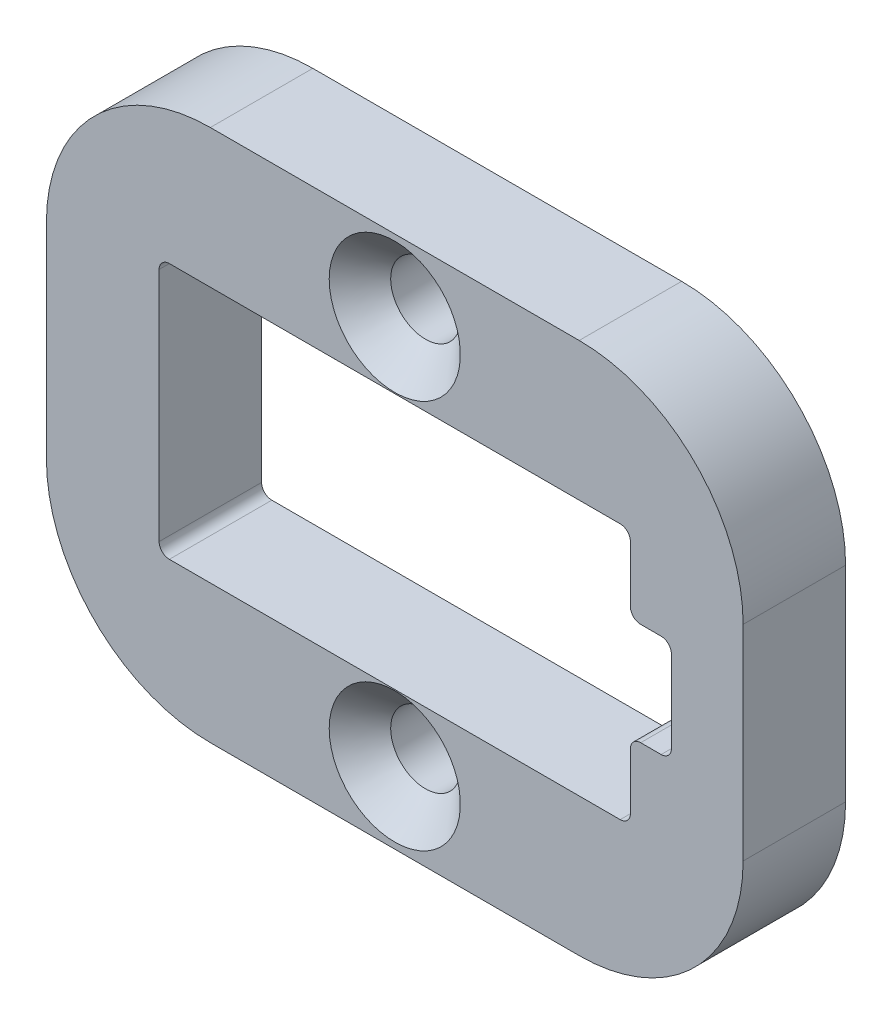
ISO-10303-21;
HEADER;
FILE_DESCRIPTION(('STEP AP214'),'2;1');
FILE_NAME('part.step','',(''),(''),'','','');
FILE_SCHEMA(('AUTOMOTIVE_DESIGN { 1 0 10303 214 1 1 1 1 }'));
ENDSEC;
DATA;
#1=APPLICATION_CONTEXT('core data for automotive mechanical design processes');
#2=APPLICATION_PROTOCOL_DEFINITION('international standard','automotive_design',2000,#1);
#3=PRODUCT_CONTEXT('',#1,'mechanical');
#4=PRODUCT('Part','Part','',(#3));
#5=PRODUCT_RELATED_PRODUCT_CATEGORY('part','',(#4));
#6=PRODUCT_DEFINITION_FORMATION('','',#4);
#7=PRODUCT_DEFINITION_CONTEXT('part definition',#1,'design');
#8=PRODUCT_DEFINITION('design','',#6,#7);
#9=PRODUCT_DEFINITION_SHAPE('','',#8);
#10=(LENGTH_UNIT() NAMED_UNIT(*) SI_UNIT(.MILLI.,.METRE.));
#11=(NAMED_UNIT(*) PLANE_ANGLE_UNIT() SI_UNIT($,.RADIAN.));
#12=(NAMED_UNIT(*) SI_UNIT($,.STERADIAN.) SOLID_ANGLE_UNIT());
#13=UNCERTAINTY_MEASURE_WITH_UNIT(LENGTH_MEASURE(1.E-05),#10,'distance_accuracy_value','');
#14=(GEOMETRIC_REPRESENTATION_CONTEXT(3) GLOBAL_UNCERTAINTY_ASSIGNED_CONTEXT((#13)) GLOBAL_UNIT_ASSIGNED_CONTEXT((#10,
#11,#12)) REPRESENTATION_CONTEXT('',''));
#15=CARTESIAN_POINT('',(0.,0.,0.));
#16=DIRECTION('',(0.,0.,1.));
#17=DIRECTION('',(1.,0.,0.));
#18=AXIS2_PLACEMENT_3D('',#15,#16,#17);
#19=CARTESIAN_POINT('',(26.1700019836426,18.1300244564913,5.));
#20=DIRECTION('',(0.,0.,-1.));
#21=DIRECTION('',(-1.,0.,0.));
#22=AXIS2_PLACEMENT_3D('',#19,#20,#21);
#23=PLANE('',#22);
#24=CARTESIAN_POINT('',(17.1700010299683,3.63000011444092,5.));
#25=DIRECTION('',(0.,0.,-1.));
#26=DIRECTION('',(-1.,0.,0.));
#27=AXIS2_PLACEMENT_3D('',#24,#25,#26);
#28=CIRCLE('',#27,3.19999980926515);
#29=CARTESIAN_POINT('',(13.9700012207031,3.63000011444092,5.));
#30=VERTEX_POINT('',#29);
#31=EDGE_CURVE('E52',#30,#30,#28,.T.);
#32=ORIENTED_EDGE('',*,*,#31,.T.);
#33=EDGE_LOOP('',(#32));
#34=FACE_BOUND('',#33,.T.);
#35=CARTESIAN_POINT('',(17.1700015068054,22.6300001144409,5.));
#36=DIRECTION('',(0.,0.,-1.));
#37=DIRECTION('',(-1.,0.,0.));
#38=AXIS2_PLACEMENT_3D('',#35,#36,#37);
#39=CIRCLE('',#38,3.20000044015809);
#40=CARTESIAN_POINT('',(13.9700010666473,22.6300001144409,5.));
#41=VERTEX_POINT('',#40);
#42=EDGE_CURVE('E462',#41,#41,#39,.T.);
#43=ORIENTED_EDGE('',*,*,#42,.T.);
#44=EDGE_LOOP('',(#43));
#45=FACE_BOUND('',#44,.T.);
#46=CARTESIAN_POINT('',(26.1700019836426,18.1300244564913,5.));
#47=DIRECTION('',(0.,0.,1.));
#48=DIRECTION('',(-1.,0.,0.));
#49=AXIS2_PLACEMENT_3D('',#46,#47,#48);
#50=CIRCLE('',#49,8.);
#51=CARTESIAN_POINT('',(34.1700019836426,18.1300244564913,5.));
#52=VERTEX_POINT('',#51);
#53=CARTESIAN_POINT('',(26.1700019836426,26.1300244564913,5.));
#54=VERTEX_POINT('',#53);
#55=EDGE_CURVE('E377',#52,#54,#50,.T.);
#56=ORIENTED_EDGE('',*,*,#55,.T.);
#57=DIRECTION('',(-1.,0.,0.));
#58=VECTOR('',#57,1.);
#59=CARTESIAN_POINT('',(26.1700019836426,26.1300244564913,5.));
#60=LINE('',#59,#58);
#61=CARTESIAN_POINT('',(8.17002752518938,26.1300244564913,5.));
#62=VERTEX_POINT('',#61);
#63=EDGE_CURVE('E381',#54,#62,#60,.T.);
#64=ORIENTED_EDGE('',*,*,#63,.T.);
#65=CARTESIAN_POINT('',(8.17002752518938,18.1300244564913,5.));
#66=DIRECTION('',(0.,0.,1.));
#67=DIRECTION('',(-1.,0.,0.));
#68=AXIS2_PLACEMENT_3D('',#65,#66,#67);
#69=CIRCLE('',#68,8.);
#70=CARTESIAN_POINT('',(0.170027525189378,18.1300244564913,5.));
#71=VERTEX_POINT('',#70);
#72=EDGE_CURVE('E385',#62,#71,#69,.T.);
#73=ORIENTED_EDGE('',*,*,#72,.T.);
#74=DIRECTION('',(0.,-1.,0.));
#75=VECTOR('',#74,1.);
#76=CARTESIAN_POINT('',(0.17002752518938,8.12999959290033,5.));
#77=LINE('',#76,#75);
#78=CARTESIAN_POINT('',(0.17002752518938,8.12999959290033,5.));
#79=VERTEX_POINT('',#78);
#80=EDGE_CURVE('E388',#71,#79,#77,.T.);
#81=ORIENTED_EDGE('',*,*,#80,.T.);
#82=CARTESIAN_POINT('',(8.17002752518938,8.12999959290028,5.));
#83=DIRECTION('',(0.,0.,1.));
#84=DIRECTION('',(-1.,0.,0.));
#85=AXIS2_PLACEMENT_3D('',#82,#83,#84);
#86=CIRCLE('',#85,8.);
#87=CARTESIAN_POINT('',(8.17002752518938,0.129999592900276,5.));
#88=VERTEX_POINT('',#87);
#89=EDGE_CURVE('E391',#79,#88,#86,.T.);
#90=ORIENTED_EDGE('',*,*,#89,.T.);
#91=DIRECTION('',(1.,0.,0.));
#92=VECTOR('',#91,1.);
#93=CARTESIAN_POINT('',(26.1700019836426,0.12999959290028,5.));
#94=LINE('',#93,#92);
#95=CARTESIAN_POINT('',(26.1700019836426,0.12999959290028,5.));
#96=VERTEX_POINT('',#95);
#97=EDGE_CURVE('E394',#88,#96,#94,.T.);
#98=ORIENTED_EDGE('',*,*,#97,.T.);
#99=CARTESIAN_POINT('',(26.1700019836426,8.12999959290028,5.));
#100=DIRECTION('',(0.,0.,1.));
#101=DIRECTION('',(-1.,0.,0.));
#102=AXIS2_PLACEMENT_3D('',#99,#100,#101);
#103=CIRCLE('',#102,8.);
#104=CARTESIAN_POINT('',(34.1700019836426,8.12999959290028,5.));
#105=VERTEX_POINT('',#104);
#106=EDGE_CURVE('E397',#96,#105,#103,.T.);
#107=ORIENTED_EDGE('',*,*,#106,.T.);
#108=DIRECTION('',(0.,1.,0.));
#109=VECTOR('',#108,1.);
#110=CARTESIAN_POINT('',(34.1700019836426,18.1300244564913,5.));
#111=LINE('',#110,#109);
#112=EDGE_CURVE('E400',#105,#52,#111,.T.);
#113=ORIENTED_EDGE('',*,*,#112,.T.);
#114=EDGE_LOOP('',(#56,#64,#73,#81,#90,#98,#107,#113));
#115=FACE_BOUND('',#114,.T.);
#116=CARTESIAN_POINT('',(29.1700019836426,10.1300001144409,5.));
#117=DIRECTION('',(0.,0.,-1.));
#118=DIRECTION('',(1.,0.,0.));
#119=AXIS2_PLACEMENT_3D('',#116,#117,#118);
#120=CIRCLE('',#119,0.5);
#121=CARTESIAN_POINT('',(28.6700019836426,10.1300001144409,5.));
#122=VERTEX_POINT('',#121);
#123=CARTESIAN_POINT('',(29.1700019836426,10.6300001144409,5.));
#124=VERTEX_POINT('',#123);
#125=EDGE_CURVE('E205',#122,#124,#120,.T.);
#126=ORIENTED_EDGE('',*,*,#125,.F.);
#127=DIRECTION('',(0.,1.,0.));
#128=VECTOR('',#127,1.);
#129=CARTESIAN_POINT('',(28.6700019836426,10.1300001144409,5.));
#130=LINE('',#129,#128);
#131=CARTESIAN_POINT('',(28.6700019836426,7.37999963760377,5.));
#132=VERTEX_POINT('',#131);
#133=EDGE_CURVE('E272',#132,#122,#130,.T.);
#134=ORIENTED_EDGE('',*,*,#133,.F.);
#135=CARTESIAN_POINT('',(28.1700019836426,7.37999963760376,5.));
#136=DIRECTION('',(0.,0.,1.));
#137=DIRECTION('',(-1.,0.,0.));
#138=AXIS2_PLACEMENT_3D('',#135,#136,#137);
#139=CIRCLE('',#138,0.5);
#140=CARTESIAN_POINT('',(28.1700019836426,6.87999963760376,5.));
#141=VERTEX_POINT('',#140);
#142=EDGE_CURVE('E269',#141,#132,#139,.T.);
#143=ORIENTED_EDGE('',*,*,#142,.F.);
#144=DIRECTION('',(1.,0.,0.));
#145=VECTOR('',#144,1.);
#146=CARTESIAN_POINT('',(6.17000102996827,6.87999963760376,5.));
#147=LINE('',#146,#145);
#148=CARTESIAN_POINT('',(6.17000102996827,6.87999963760376,5.));
#149=VERTEX_POINT('',#148);
#150=EDGE_CURVE('E266',#149,#141,#147,.T.);
#151=ORIENTED_EDGE('',*,*,#150,.F.);
#152=CARTESIAN_POINT('',(6.17000102996826,7.37999963760376,5.));
#153=DIRECTION('',(0.,0.,1.));
#154=DIRECTION('',(1.,0.,0.));
#155=AXIS2_PLACEMENT_3D('',#152,#153,#154);
#156=CIRCLE('',#155,0.5);
#157=CARTESIAN_POINT('',(5.67000102996826,7.37999963760376,5.));
#158=VERTEX_POINT('',#157);
#159=EDGE_CURVE('E263',#158,#149,#156,.T.);
#160=ORIENTED_EDGE('',*,*,#159,.F.);
#161=DIRECTION('',(0.,-1.,0.));
#162=VECTOR('',#161,1.);
#163=CARTESIAN_POINT('',(5.67000102996826,18.8799991607666,5.));
#164=LINE('',#163,#162);
#165=CARTESIAN_POINT('',(5.67000102996826,18.8799991607666,5.));
#166=VERTEX_POINT('',#165);
#167=EDGE_CURVE('E260',#166,#158,#164,.T.);
#168=ORIENTED_EDGE('',*,*,#167,.F.);
#169=CARTESIAN_POINT('',(6.17000102996826,18.8799991607666,5.));
#170=DIRECTION('',(0.,0.,1.));
#171=DIRECTION('',(1.,0.,0.));
#172=AXIS2_PLACEMENT_3D('',#169,#170,#171);
#173=CIRCLE('',#172,0.5);
#174=CARTESIAN_POINT('',(6.17000102996826,19.3799991607666,5.));
#175=VERTEX_POINT('',#174);
#176=EDGE_CURVE('E257',#175,#166,#173,.T.);
#177=ORIENTED_EDGE('',*,*,#176,.F.);
#178=DIRECTION('',(-1.,0.,0.));
#179=VECTOR('',#178,1.);
#180=CARTESIAN_POINT('',(6.17000102996826,19.3799991607666,5.));
#181=LINE('',#180,#179);
#182=CARTESIAN_POINT('',(28.1700019836426,19.3799991607666,5.));
#183=VERTEX_POINT('',#182);
#184=EDGE_CURVE('E254',#183,#175,#181,.T.);
#185=ORIENTED_EDGE('',*,*,#184,.F.);
#186=CARTESIAN_POINT('',(28.1700019836426,18.8799991607666,5.));
#187=DIRECTION('',(0.,0.,1.));
#188=DIRECTION('',(-1.,0.,0.));
#189=AXIS2_PLACEMENT_3D('',#186,#187,#188);
#190=CIRCLE('',#189,0.5);
#191=CARTESIAN_POINT('',(28.6700019836426,18.8799991607666,5.));
#192=VERTEX_POINT('',#191);
#193=EDGE_CURVE('E251',#192,#183,#190,.T.);
#194=ORIENTED_EDGE('',*,*,#193,.F.);
#195=DIRECTION('',(0.,1.,0.));
#196=VECTOR('',#195,1.);
#197=CARTESIAN_POINT('',(28.6700019836426,18.8799991607666,5.));
#198=LINE('',#197,#196);
#199=CARTESIAN_POINT('',(28.6700019836426,16.1299991607666,5.));
#200=VERTEX_POINT('',#199);
#201=EDGE_CURVE('E248',#200,#192,#198,.T.);
#202=ORIENTED_EDGE('',*,*,#201,.F.);
#203=CARTESIAN_POINT('',(29.1700019836426,16.1299991607666,5.));
#204=DIRECTION('',(0.,0.,-1.));
#205=DIRECTION('',(1.,0.,0.));
#206=AXIS2_PLACEMENT_3D('',#203,#204,#205);
#207=CIRCLE('',#206,0.5);
#208=CARTESIAN_POINT('',(29.1700019836426,15.6299991607666,5.));
#209=VERTEX_POINT('',#208);
#210=EDGE_CURVE('E245',#209,#200,#207,.T.);
#211=ORIENTED_EDGE('',*,*,#210,.F.);
#212=DIRECTION('',(-1.,0.,0.));
#213=VECTOR('',#212,1.);
#214=CARTESIAN_POINT('',(30.1700019836426,15.6299991607666,5.));
#215=LINE('',#214,#213);
#216=CARTESIAN_POINT('',(30.1700019836426,15.6299991607666,5.));
#217=VERTEX_POINT('',#216);
#218=EDGE_CURVE('E242',#217,#209,#215,.T.);
#219=ORIENTED_EDGE('',*,*,#218,.F.);
#220=CARTESIAN_POINT('',(30.1700019836426,15.1299991607666,5.));
#221=DIRECTION('',(0.,0.,1.));
#222=DIRECTION('',(-1.,0.,0.));
#223=AXIS2_PLACEMENT_3D('',#220,#221,#222);
#224=CIRCLE('',#223,0.5);
#225=CARTESIAN_POINT('',(30.6700019836426,15.1299991607666,5.));
#226=VERTEX_POINT('',#225);
#227=EDGE_CURVE('E239',#226,#217,#224,.T.);
#228=ORIENTED_EDGE('',*,*,#227,.F.);
#229=DIRECTION('',(0.,1.,0.));
#230=VECTOR('',#229,1.);
#231=CARTESIAN_POINT('',(30.6700019836426,15.1299991607666,5.));
#232=LINE('',#231,#230);
#233=CARTESIAN_POINT('',(30.6700019836426,11.1300001144409,5.));
#234=VERTEX_POINT('',#233);
#235=EDGE_CURVE('E233',#234,#226,#232,.T.);
#236=ORIENTED_EDGE('',*,*,#235,.F.);
#237=CARTESIAN_POINT('',(30.1700019836426,11.1300001144409,5.));
#238=DIRECTION('',(0.,0.,1.));
#239=DIRECTION('',(-1.,0.,0.));
#240=AXIS2_PLACEMENT_3D('',#237,#238,#239);
#241=CIRCLE('',#240,0.5);
#242=CARTESIAN_POINT('',(30.1700019836426,10.6300001144409,5.));
#243=VERTEX_POINT('',#242);
#244=EDGE_CURVE('E228',#243,#234,#241,.T.);
#245=ORIENTED_EDGE('',*,*,#244,.F.);
#246=DIRECTION('',(1.,0.,0.));
#247=VECTOR('',#246,1.);
#248=CARTESIAN_POINT('',(30.1700019836426,10.6300001144409,5.));
#249=LINE('',#248,#247);
#250=EDGE_CURVE('E214',#124,#243,#249,.T.);
#251=ORIENTED_EDGE('',*,*,#250,.F.);
#252=EDGE_LOOP('',(#126,#134,#143,#151,#160,#168,#177,#185,#194,#202,#211,#219,#228,#236,#245,#251));
#253=FACE_BOUND('',#252,.T.);
#254=ADVANCED_FACE('F42',(#34,#45,#115,#253),#23,.F.);
#255=CARTESIAN_POINT('',(26.1700019836426,18.1300244564913,0.));
#256=DIRECTION('',(0.,0.,-1.));
#257=DIRECTION('',(-1.,0.,0.));
#258=AXIS2_PLACEMENT_3D('',#255,#256,#257);
#259=PLANE('',#258);
#260=CARTESIAN_POINT('',(17.1700010299683,3.63000011444092,0.));
#261=DIRECTION('',(0.,0.,1.));
#262=DIRECTION('',(1.,0.,0.));
#263=AXIS2_PLACEMENT_3D('',#260,#261,#262);
#264=CIRCLE('',#263,1.69999980926514);
#265=CARTESIAN_POINT('',(18.8700008392334,3.63000011444092,0.));
#266=VERTEX_POINT('',#265);
#267=EDGE_CURVE('E277',#266,#266,#264,.T.);
#268=ORIENTED_EDGE('',*,*,#267,.T.);
#269=EDGE_LOOP('',(#268));
#270=FACE_BOUND('',#269,.T.);
#271=CARTESIAN_POINT('',(26.1700019836426,18.1300244564913,0.));
#272=DIRECTION('',(0.,0.,1.));
#273=DIRECTION('',(-1.,0.,0.));
#274=AXIS2_PLACEMENT_3D('',#271,#272,#273);
#275=CIRCLE('',#274,8.);
#276=CARTESIAN_POINT('',(34.1700019836426,18.1300244564913,0.));
#277=VERTEX_POINT('',#276);
#278=CARTESIAN_POINT('',(26.1700019836426,26.1300244564913,0.));
#279=VERTEX_POINT('',#278);
#280=EDGE_CURVE('E223',#277,#279,#275,.T.);
#281=ORIENTED_EDGE('',*,*,#280,.F.);
#282=DIRECTION('',(0.,1.,0.));
#283=VECTOR('',#282,1.);
#284=CARTESIAN_POINT('',(34.1700019836426,18.1300244564913,0.));
#285=LINE('',#284,#283);
#286=CARTESIAN_POINT('',(34.1700019836426,8.12999959290028,0.));
#287=VERTEX_POINT('',#286);
#288=EDGE_CURVE('E382',#287,#277,#285,.T.);
#289=ORIENTED_EDGE('',*,*,#288,.F.);
#290=CARTESIAN_POINT('',(26.1700019836426,8.12999959290028,0.));
#291=DIRECTION('',(0.,0.,1.));
#292=DIRECTION('',(-1.,0.,0.));
#293=AXIS2_PLACEMENT_3D('',#290,#291,#292);
#294=CIRCLE('',#293,8.);
#295=CARTESIAN_POINT('',(26.1700019836426,0.12999959290028,0.));
#296=VERTEX_POINT('',#295);
#297=EDGE_CURVE('E422',#296,#287,#294,.T.);
#298=ORIENTED_EDGE('',*,*,#297,.F.);
#299=DIRECTION('',(1.,0.,0.));
#300=VECTOR('',#299,1.);
#301=CARTESIAN_POINT('',(26.1700019836426,0.12999959290028,0.));
#302=LINE('',#301,#300);
#303=CARTESIAN_POINT('',(8.17002752518938,0.129999592900276,0.));
#304=VERTEX_POINT('',#303);
#305=EDGE_CURVE('E419',#304,#296,#302,.T.);
#306=ORIENTED_EDGE('',*,*,#305,.F.);
#307=CARTESIAN_POINT('',(8.17002752518938,8.12999959290028,0.));
#308=DIRECTION('',(0.,0.,1.));
#309=DIRECTION('',(-1.,0.,0.));
#310=AXIS2_PLACEMENT_3D('',#307,#308,#309);
#311=CIRCLE('',#310,8.);
#312=CARTESIAN_POINT('',(0.17002752518938,8.12999959290033,0.));
#313=VERTEX_POINT('',#312);
#314=EDGE_CURVE('E416',#313,#304,#311,.T.);
#315=ORIENTED_EDGE('',*,*,#314,.F.);
#316=DIRECTION('',(0.,-1.,0.));
#317=VECTOR('',#316,1.);
#318=CARTESIAN_POINT('',(0.17002752518938,8.12999959290033,0.));
#319=LINE('',#318,#317);
#320=CARTESIAN_POINT('',(0.170027525189378,18.1300244564913,0.));
#321=VERTEX_POINT('',#320);
#322=EDGE_CURVE('E413',#321,#313,#319,.T.);
#323=ORIENTED_EDGE('',*,*,#322,.F.);
#324=CARTESIAN_POINT('',(8.17002752518938,18.1300244564913,0.));
#325=DIRECTION('',(0.,0.,1.));
#326=DIRECTION('',(-1.,0.,0.));
#327=AXIS2_PLACEMENT_3D('',#324,#325,#326);
#328=CIRCLE('',#327,8.);
#329=CARTESIAN_POINT('',(8.17002752518938,26.1300244564913,0.));
#330=VERTEX_POINT('',#329);
#331=EDGE_CURVE('E410',#330,#321,#328,.T.);
#332=ORIENTED_EDGE('',*,*,#331,.F.);
#333=DIRECTION('',(-1.,0.,0.));
#334=VECTOR('',#333,1.);
#335=CARTESIAN_POINT('',(26.1700019836426,26.1300244564913,0.));
#336=LINE('',#335,#334);
#337=EDGE_CURVE('E407',#279,#330,#336,.T.);
#338=ORIENTED_EDGE('',*,*,#337,.F.);
#339=EDGE_LOOP('',(#281,#289,#298,#306,#315,#323,#332,#338));
#340=FACE_BOUND('',#339,.T.);
#341=DIRECTION('',(0.,1.,0.));
#342=VECTOR('',#341,1.);
#343=CARTESIAN_POINT('',(28.6700019836426,10.1300001144409,0.));
#344=LINE('',#343,#342);
#345=CARTESIAN_POINT('',(28.6700019836426,7.37999963760376,0.));
#346=VERTEX_POINT('',#345);
#347=CARTESIAN_POINT('',(28.6700019836426,10.1300001144409,0.));
#348=VERTEX_POINT('',#347);
#349=EDGE_CURVE('E215',#346,#348,#344,.T.);
#350=ORIENTED_EDGE('',*,*,#349,.T.);
#351=CARTESIAN_POINT('',(29.1700019836426,10.1300001144409,0.));
#352=DIRECTION('',(0.,0.,-1.));
#353=DIRECTION('',(1.,0.,0.));
#354=AXIS2_PLACEMENT_3D('',#351,#352,#353);
#355=CIRCLE('',#354,0.5);
#356=CARTESIAN_POINT('',(29.1700019836426,10.6300001144409,0.));
#357=VERTEX_POINT('',#356);
#358=EDGE_CURVE('E67',#348,#357,#355,.T.);
#359=ORIENTED_EDGE('',*,*,#358,.T.);
#360=DIRECTION('',(1.,0.,0.));
#361=VECTOR('',#360,1.);
#362=CARTESIAN_POINT('',(30.1700019836426,10.6300001144409,0.));
#363=LINE('',#362,#361);
#364=CARTESIAN_POINT('',(30.1700019836426,10.6300001144409,0.));
#365=VERTEX_POINT('',#364);
#366=EDGE_CURVE('E221',#357,#365,#363,.T.);
#367=ORIENTED_EDGE('',*,*,#366,.T.);
#368=CARTESIAN_POINT('',(30.1700019836426,11.1300001144409,0.));
#369=DIRECTION('',(0.,0.,1.));
#370=DIRECTION('',(-1.,0.,0.));
#371=AXIS2_PLACEMENT_3D('',#368,#369,#370);
#372=CIRCLE('',#371,0.5);
#373=CARTESIAN_POINT('',(30.6700019836426,11.1300001144409,0.));
#374=VERTEX_POINT('',#373);
#375=EDGE_CURVE('E280',#365,#374,#372,.T.);
#376=ORIENTED_EDGE('',*,*,#375,.T.);
#377=DIRECTION('',(0.,1.,0.));
#378=VECTOR('',#377,1.);
#379=CARTESIAN_POINT('',(30.6700019836426,15.1299991607666,0.));
#380=LINE('',#379,#378);
#381=CARTESIAN_POINT('',(30.6700019836426,15.1299991607666,0.));
#382=VERTEX_POINT('',#381);
#383=EDGE_CURVE('E284',#374,#382,#380,.T.);
#384=ORIENTED_EDGE('',*,*,#383,.T.);
#385=CARTESIAN_POINT('',(30.1700019836426,15.1299991607666,0.));
#386=DIRECTION('',(0.,0.,1.));
#387=DIRECTION('',(-1.,0.,0.));
#388=AXIS2_PLACEMENT_3D('',#385,#386,#387);
#389=CIRCLE('',#388,0.5);
#390=CARTESIAN_POINT('',(30.1700019836426,15.6299991607666,0.));
#391=VERTEX_POINT('',#390);
#392=EDGE_CURVE('E288',#382,#391,#389,.T.);
#393=ORIENTED_EDGE('',*,*,#392,.T.);
#394=DIRECTION('',(-1.,0.,0.));
#395=VECTOR('',#394,1.);
#396=CARTESIAN_POINT('',(30.1700019836426,15.6299991607666,0.));
#397=LINE('',#396,#395);
#398=CARTESIAN_POINT('',(29.1700019836426,15.6299991607666,0.));
#399=VERTEX_POINT('',#398);
#400=EDGE_CURVE('E292',#391,#399,#397,.T.);
#401=ORIENTED_EDGE('',*,*,#400,.T.);
#402=CARTESIAN_POINT('',(29.1700019836426,16.1299991607666,0.));
#403=DIRECTION('',(0.,0.,-1.));
#404=DIRECTION('',(1.,0.,0.));
#405=AXIS2_PLACEMENT_3D('',#402,#403,#404);
#406=CIRCLE('',#405,0.5);
#407=CARTESIAN_POINT('',(28.6700019836426,16.1299991607666,0.));
#408=VERTEX_POINT('',#407);
#409=EDGE_CURVE('E296',#399,#408,#406,.T.);
#410=ORIENTED_EDGE('',*,*,#409,.T.);
#411=DIRECTION('',(0.,1.,0.));
#412=VECTOR('',#411,1.);
#413=CARTESIAN_POINT('',(28.6700019836426,18.8799991607666,0.));
#414=LINE('',#413,#412);
#415=CARTESIAN_POINT('',(28.6700019836426,18.8799991607666,0.));
#416=VERTEX_POINT('',#415);
#417=EDGE_CURVE('E300',#408,#416,#414,.T.);
#418=ORIENTED_EDGE('',*,*,#417,.T.);
#419=CARTESIAN_POINT('',(28.1700019836426,18.8799991607666,0.));
#420=DIRECTION('',(0.,0.,1.));
#421=DIRECTION('',(-1.,0.,0.));
#422=AXIS2_PLACEMENT_3D('',#419,#420,#421);
#423=CIRCLE('',#422,0.5);
#424=CARTESIAN_POINT('',(28.1700019836426,19.3799991607666,0.));
#425=VERTEX_POINT('',#424);
#426=EDGE_CURVE('E304',#416,#425,#423,.T.);
#427=ORIENTED_EDGE('',*,*,#426,.T.);
#428=DIRECTION('',(-1.,0.,0.));
#429=VECTOR('',#428,1.);
#430=CARTESIAN_POINT('',(6.17000102996826,19.3799991607666,0.));
#431=LINE('',#430,#429);
#432=CARTESIAN_POINT('',(6.17000102996826,19.3799991607666,0.));
#433=VERTEX_POINT('',#432);
#434=EDGE_CURVE('E308',#425,#433,#431,.T.);
#435=ORIENTED_EDGE('',*,*,#434,.T.);
#436=CARTESIAN_POINT('',(6.17000102996826,18.8799991607666,0.));
#437=DIRECTION('',(0.,0.,1.));
#438=DIRECTION('',(1.,0.,0.));
#439=AXIS2_PLACEMENT_3D('',#436,#437,#438);
#440=CIRCLE('',#439,0.5);
#441=CARTESIAN_POINT('',(5.67000102996826,18.8799991607666,0.));
#442=VERTEX_POINT('',#441);
#443=EDGE_CURVE('E312',#433,#442,#440,.T.);
#444=ORIENTED_EDGE('',*,*,#443,.T.);
#445=DIRECTION('',(0.,-1.,0.));
#446=VECTOR('',#445,1.);
#447=CARTESIAN_POINT('',(5.67000102996826,18.8799991607666,0.));
#448=LINE('',#447,#446);
#449=CARTESIAN_POINT('',(5.67000102996826,7.37999963760376,0.));
#450=VERTEX_POINT('',#449);
#451=EDGE_CURVE('E316',#442,#450,#448,.T.);
#452=ORIENTED_EDGE('',*,*,#451,.T.);
#453=CARTESIAN_POINT('',(6.17000102996826,7.37999963760376,0.));
#454=DIRECTION('',(0.,0.,1.));
#455=DIRECTION('',(1.,0.,0.));
#456=AXIS2_PLACEMENT_3D('',#453,#454,#455);
#457=CIRCLE('',#456,0.5);
#458=CARTESIAN_POINT('',(6.17000102996827,6.87999963760376,0.));
#459=VERTEX_POINT('',#458);
#460=EDGE_CURVE('E320',#450,#459,#457,.T.);
#461=ORIENTED_EDGE('',*,*,#460,.T.);
#462=DIRECTION('',(1.,0.,0.));
#463=VECTOR('',#462,1.);
#464=CARTESIAN_POINT('',(6.17000102996827,6.87999963760376,0.));
#465=LINE('',#464,#463);
#466=CARTESIAN_POINT('',(28.1700019836426,6.87999963760376,0.));
#467=VERTEX_POINT('',#466);
#468=EDGE_CURVE('E324',#459,#467,#465,.T.);
#469=ORIENTED_EDGE('',*,*,#468,.T.);
#470=CARTESIAN_POINT('',(28.1700019836426,7.37999963760376,0.));
#471=DIRECTION('',(0.,0.,1.));
#472=DIRECTION('',(-1.,0.,0.));
#473=AXIS2_PLACEMENT_3D('',#470,#471,#472);
#474=CIRCLE('',#473,0.5);
#475=EDGE_CURVE('E328',#467,#346,#474,.T.);
#476=ORIENTED_EDGE('',*,*,#475,.T.);
#477=EDGE_LOOP('',(#350,#359,#367,#376,#384,#393,#401,#410,#418,#427,#435,#444,#452,#461,#469,#476));
#478=FACE_BOUND('',#477,.T.);
#479=CARTESIAN_POINT('',(17.1700015068054,22.6300001144409,0.));
#480=DIRECTION('',(0.,0.,1.));
#481=DIRECTION('',(1.,0.,0.));
#482=AXIS2_PLACEMENT_3D('',#479,#480,#481);
#483=CIRCLE('',#482,1.70000044015809);
#484=CARTESIAN_POINT('',(18.8700019469635,22.6300001144409,0.));
#485=VERTEX_POINT('',#484);
#486=EDGE_CURVE('E487',#485,#485,#483,.T.);
#487=ORIENTED_EDGE('',*,*,#486,.T.);
#488=EDGE_LOOP('',(#487));
#489=FACE_BOUND('',#488,.T.);
#490=ADVANCED_FACE('F495',(#270,#340,#478,#489),#259,.T.);
#491=CARTESIAN_POINT('',(26.1700019836426,18.1300244564913,5.));
#492=DIRECTION('',(0.,0.,-1.));
#493=DIRECTION('',(-1.,0.,0.));
#494=AXIS2_PLACEMENT_3D('',#491,#492,#493);
#495=CYLINDRICAL_SURFACE('',#494,8.);
#496=ORIENTED_EDGE('',*,*,#280,.T.);
#497=DIRECTION('',(0.,0.,-1.));
#498=VECTOR('',#497,1.);
#499=CARTESIAN_POINT('',(26.1700019836426,26.1300244564913,5.));
#500=LINE('',#499,#498);
#501=EDGE_CURVE('E454',#54,#279,#500,.T.);
#502=ORIENTED_EDGE('',*,*,#501,.F.);
#503=ORIENTED_EDGE('',*,*,#55,.F.);
#504=DIRECTION('',(0.,0.,-1.));
#505=VECTOR('',#504,1.);
#506=CARTESIAN_POINT('',(34.1700019836426,18.1300244564913,5.));
#507=LINE('',#506,#505);
#508=EDGE_CURVE('E403',#52,#277,#507,.T.);
#509=ORIENTED_EDGE('',*,*,#508,.T.);
#510=EDGE_LOOP('',(#496,#502,#503,#509));
#511=FACE_BOUND('',#510,.T.);
#512=ADVANCED_FACE('F507',(#511),#495,.T.);
#513=CARTESIAN_POINT('',(26.1700019836426,26.1300244564913,5.));
#514=DIRECTION('',(0.,-1.,0.));
#515=DIRECTION('',(0.,0.,-1.));
#516=AXIS2_PLACEMENT_3D('',#513,#514,#515);
#517=PLANE('',#516);
#518=ORIENTED_EDGE('',*,*,#337,.T.);
#519=DIRECTION('',(0.,0.,-1.));
#520=VECTOR('',#519,1.);
#521=CARTESIAN_POINT('',(8.17002752518938,26.1300244564913,5.));
#522=LINE('',#521,#520);
#523=EDGE_CURVE('E450',#62,#330,#522,.T.);
#524=ORIENTED_EDGE('',*,*,#523,.F.);
#525=ORIENTED_EDGE('',*,*,#63,.F.);
#526=ORIENTED_EDGE('',*,*,#501,.T.);
#527=EDGE_LOOP('',(#518,#524,#525,#526));
#528=FACE_BOUND('',#527,.T.);
#529=ADVANCED_FACE('F535',(#528),#517,.F.);
#530=CARTESIAN_POINT('',(8.17002752518938,18.1300244564913,5.));
#531=DIRECTION('',(0.,0.,-1.));
#532=DIRECTION('',(-1.,0.,0.));
#533=AXIS2_PLACEMENT_3D('',#530,#531,#532);
#534=CYLINDRICAL_SURFACE('',#533,8.);
#535=ORIENTED_EDGE('',*,*,#331,.T.);
#536=DIRECTION('',(0.,0.,-1.));
#537=VECTOR('',#536,1.);
#538=CARTESIAN_POINT('',(0.170027525189378,18.1300244564913,5.));
#539=LINE('',#538,#537);
#540=EDGE_CURVE('E446',#71,#321,#539,.T.);
#541=ORIENTED_EDGE('',*,*,#540,.F.);
#542=ORIENTED_EDGE('',*,*,#72,.F.);
#543=ORIENTED_EDGE('',*,*,#523,.T.);
#544=EDGE_LOOP('',(#535,#541,#542,#543));
#545=FACE_BOUND('',#544,.T.);
#546=ADVANCED_FACE('F531',(#545),#534,.T.);
#547=CARTESIAN_POINT('',(0.17002752518938,8.12999959290033,5.));
#548=DIRECTION('',(1.,0.,0.));
#549=DIRECTION('',(0.,1.,0.));
#550=AXIS2_PLACEMENT_3D('',#547,#548,#549);
#551=PLANE('',#550);
#552=ORIENTED_EDGE('',*,*,#322,.T.);
#553=DIRECTION('',(0.,0.,-1.));
#554=VECTOR('',#553,1.);
#555=CARTESIAN_POINT('',(0.17002752518938,8.12999959290033,5.));
#556=LINE('',#555,#554);
#557=EDGE_CURVE('E442',#79,#313,#556,.T.);
#558=ORIENTED_EDGE('',*,*,#557,.F.);
#559=ORIENTED_EDGE('',*,*,#80,.F.);
#560=ORIENTED_EDGE('',*,*,#540,.T.);
#561=EDGE_LOOP('',(#552,#558,#559,#560));
#562=FACE_BOUND('',#561,.T.);
#563=ADVANCED_FACE('F527',(#562),#551,.F.);
#564=CARTESIAN_POINT('',(8.17002752518938,8.12999959290028,5.));
#565=DIRECTION('',(0.,0.,-1.));
#566=DIRECTION('',(-1.,0.,0.));
#567=AXIS2_PLACEMENT_3D('',#564,#565,#566);
#568=CYLINDRICAL_SURFACE('',#567,8.);
#569=ORIENTED_EDGE('',*,*,#314,.T.);
#570=DIRECTION('',(0.,0.,-1.));
#571=VECTOR('',#570,1.);
#572=CARTESIAN_POINT('',(8.17002752518938,0.129999592900276,5.));
#573=LINE('',#572,#571);
#574=EDGE_CURVE('E438',#88,#304,#573,.T.);
#575=ORIENTED_EDGE('',*,*,#574,.F.);
#576=ORIENTED_EDGE('',*,*,#89,.F.);
#577=ORIENTED_EDGE('',*,*,#557,.T.);
#578=EDGE_LOOP('',(#569,#575,#576,#577));
#579=FACE_BOUND('',#578,.T.);
#580=ADVANCED_FACE('F523',(#579),#568,.T.);
#581=CARTESIAN_POINT('',(26.1700019836426,0.12999959290028,5.));
#582=DIRECTION('',(0.,1.,0.));
#583=DIRECTION('',(-1.,0.,0.));
#584=AXIS2_PLACEMENT_3D('',#581,#582,#583);
#585=PLANE('',#584);
#586=ORIENTED_EDGE('',*,*,#305,.T.);
#587=DIRECTION('',(0.,0.,-1.));
#588=VECTOR('',#587,1.);
#589=CARTESIAN_POINT('',(26.1700019836426,0.12999959290028,5.));
#590=LINE('',#589,#588);
#591=EDGE_CURVE('E434',#96,#296,#590,.T.);
#592=ORIENTED_EDGE('',*,*,#591,.F.);
#593=ORIENTED_EDGE('',*,*,#97,.F.);
#594=ORIENTED_EDGE('',*,*,#574,.T.);
#595=EDGE_LOOP('',(#586,#592,#593,#594));
#596=FACE_BOUND('',#595,.T.);
#597=ADVANCED_FACE('F519',(#596),#585,.F.);
#598=CARTESIAN_POINT('',(26.1700019836426,8.12999959290028,5.));
#599=DIRECTION('',(0.,0.,-1.));
#600=DIRECTION('',(-1.,0.,0.));
#601=AXIS2_PLACEMENT_3D('',#598,#599,#600);
#602=CYLINDRICAL_SURFACE('',#601,8.);
#603=ORIENTED_EDGE('',*,*,#297,.T.);
#604=DIRECTION('',(0.,0.,-1.));
#605=VECTOR('',#604,1.);
#606=CARTESIAN_POINT('',(34.1700019836426,8.12999959290028,5.));
#607=LINE('',#606,#605);
#608=EDGE_CURVE('E430',#105,#287,#607,.T.);
#609=ORIENTED_EDGE('',*,*,#608,.F.);
#610=ORIENTED_EDGE('',*,*,#106,.F.);
#611=ORIENTED_EDGE('',*,*,#591,.T.);
#612=EDGE_LOOP('',(#603,#609,#610,#611));
#613=FACE_BOUND('',#612,.T.);
#614=ADVANCED_FACE('F515',(#613),#602,.T.);
#615=CARTESIAN_POINT('',(34.1700019836426,18.1300244564913,5.));
#616=DIRECTION('',(-1.,0.,0.));
#617=DIRECTION('',(0.,-1.,0.));
#618=AXIS2_PLACEMENT_3D('',#615,#616,#617);
#619=PLANE('',#618);
#620=ORIENTED_EDGE('',*,*,#288,.T.);
#621=ORIENTED_EDGE('',*,*,#508,.F.);
#622=ORIENTED_EDGE('',*,*,#112,.F.);
#623=ORIENTED_EDGE('',*,*,#608,.T.);
#624=EDGE_LOOP('',(#620,#621,#622,#623));
#625=FACE_BOUND('',#624,.T.);
#626=ADVANCED_FACE('F512',(#625),#619,.F.);
#627=CARTESIAN_POINT('',(29.1700019836426,10.1300001144409,5.));
#628=DIRECTION('',(0.,0.,-1.));
#629=DIRECTION('',(-1.,0.,0.));
#630=AXIS2_PLACEMENT_3D('',#627,#628,#629);
#631=CYLINDRICAL_SURFACE('',#630,0.5);
#632=ORIENTED_EDGE('',*,*,#358,.F.);
#633=DIRECTION('',(0.,0.,-1.));
#634=VECTOR('',#633,1.);
#635=CARTESIAN_POINT('',(28.6700019836426,10.1300001144409,5.));
#636=LINE('',#635,#634);
#637=EDGE_CURVE('E209',#122,#348,#636,.T.);
#638=ORIENTED_EDGE('',*,*,#637,.F.);
#639=ORIENTED_EDGE('',*,*,#125,.T.);
#640=DIRECTION('',(0.,0.,-1.));
#641=VECTOR('',#640,1.);
#642=CARTESIAN_POINT('',(29.1700019836426,10.6300001144409,5.));
#643=LINE('',#642,#641);
#644=EDGE_CURVE('E208',#124,#357,#643,.T.);
#645=ORIENTED_EDGE('',*,*,#644,.T.);
#646=EDGE_LOOP('',(#632,#638,#639,#645));
#647=FACE_BOUND('',#646,.T.);
#648=ADVANCED_FACE('F207',(#647),#631,.T.);
#649=CARTESIAN_POINT('',(30.1700019836426,10.6300001144409,5.));
#650=DIRECTION('',(0.,1.,0.));
#651=DIRECTION('',(0.,0.,1.));
#652=AXIS2_PLACEMENT_3D('',#649,#650,#651);
#653=PLANE('',#652);
#654=ORIENTED_EDGE('',*,*,#366,.F.);
#655=ORIENTED_EDGE('',*,*,#644,.F.);
#656=ORIENTED_EDGE('',*,*,#250,.T.);
#657=DIRECTION('',(0.,0.,-1.));
#658=VECTOR('',#657,1.);
#659=CARTESIAN_POINT('',(30.1700019836426,10.6300001144409,5.));
#660=LINE('',#659,#658);
#661=EDGE_CURVE('E224',#243,#365,#660,.T.);
#662=ORIENTED_EDGE('',*,*,#661,.T.);
#663=EDGE_LOOP('',(#654,#655,#656,#662));
#664=FACE_BOUND('',#663,.T.);
#665=ADVANCED_FACE('F218',(#664),#653,.T.);
#666=CARTESIAN_POINT('',(30.1700019836426,11.1300001144409,5.));
#667=DIRECTION('',(0.,0.,-1.));
#668=DIRECTION('',(-1.,0.,0.));
#669=AXIS2_PLACEMENT_3D('',#666,#667,#668);
#670=CYLINDRICAL_SURFACE('',#669,0.5);
#671=ORIENTED_EDGE('',*,*,#375,.F.);
#672=ORIENTED_EDGE('',*,*,#661,.F.);
#673=ORIENTED_EDGE('',*,*,#244,.T.);
#674=DIRECTION('',(0.,0.,-1.));
#675=VECTOR('',#674,1.);
#676=CARTESIAN_POINT('',(30.6700019836426,11.1300001144409,5.));
#677=LINE('',#676,#675);
#678=EDGE_CURVE('E372',#234,#374,#677,.T.);
#679=ORIENTED_EDGE('',*,*,#678,.T.);
#680=EDGE_LOOP('',(#671,#672,#673,#679));
#681=FACE_BOUND('',#680,.T.);
#682=ADVANCED_FACE('F635',(#681),#670,.F.);
#683=CARTESIAN_POINT('',(30.6700019836426,15.1299991607666,5.));
#684=DIRECTION('',(-1.,0.,0.));
#685=DIRECTION('',(0.,0.,1.));
#686=AXIS2_PLACEMENT_3D('',#683,#684,#685);
#687=PLANE('',#686);
#688=ORIENTED_EDGE('',*,*,#383,.F.);
#689=ORIENTED_EDGE('',*,*,#678,.F.);
#690=ORIENTED_EDGE('',*,*,#235,.T.);
#691=DIRECTION('',(0.,0.,-1.));
#692=VECTOR('',#691,1.);
#693=CARTESIAN_POINT('',(30.6700019836426,15.1299991607666,5.));
#694=LINE('',#693,#692);
#695=EDGE_CURVE('E369',#226,#382,#694,.T.);
#696=ORIENTED_EDGE('',*,*,#695,.T.);
#697=EDGE_LOOP('',(#688,#689,#690,#696));
#698=FACE_BOUND('',#697,.T.);
#699=ADVANCED_FACE('F631',(#698),#687,.T.);
#700=CARTESIAN_POINT('',(30.1700019836426,15.1299991607666,5.));
#701=DIRECTION('',(0.,0.,-1.));
#702=DIRECTION('',(-1.,0.,0.));
#703=AXIS2_PLACEMENT_3D('',#700,#701,#702);
#704=CYLINDRICAL_SURFACE('',#703,0.5);
#705=ORIENTED_EDGE('',*,*,#392,.F.);
#706=ORIENTED_EDGE('',*,*,#695,.F.);
#707=ORIENTED_EDGE('',*,*,#227,.T.);
#708=DIRECTION('',(0.,0.,-1.));
#709=VECTOR('',#708,1.);
#710=CARTESIAN_POINT('',(30.1700019836426,15.6299991607666,5.));
#711=LINE('',#710,#709);
#712=EDGE_CURVE('E366',#217,#391,#711,.T.);
#713=ORIENTED_EDGE('',*,*,#712,.T.);
#714=EDGE_LOOP('',(#705,#706,#707,#713));
#715=FACE_BOUND('',#714,.T.);
#716=ADVANCED_FACE('F627',(#715),#704,.F.);
#717=CARTESIAN_POINT('',(30.1700019836426,15.6299991607666,5.));
#718=DIRECTION('',(0.,-1.,0.));
#719=DIRECTION('',(0.,0.,-1.));
#720=AXIS2_PLACEMENT_3D('',#717,#718,#719);
#721=PLANE('',#720);
#722=ORIENTED_EDGE('',*,*,#400,.F.);
#723=ORIENTED_EDGE('',*,*,#712,.F.);
#724=ORIENTED_EDGE('',*,*,#218,.T.);
#725=DIRECTION('',(0.,0.,-1.));
#726=VECTOR('',#725,1.);
#727=CARTESIAN_POINT('',(29.1700019836426,15.6299991607666,5.));
#728=LINE('',#727,#726);
#729=EDGE_CURVE('E363',#209,#399,#728,.T.);
#730=ORIENTED_EDGE('',*,*,#729,.T.);
#731=EDGE_LOOP('',(#722,#723,#724,#730));
#732=FACE_BOUND('',#731,.T.);
#733=ADVANCED_FACE('F624',(#732),#721,.T.);
#734=CARTESIAN_POINT('',(29.1700019836426,16.1299991607666,5.));
#735=DIRECTION('',(0.,0.,-1.));
#736=DIRECTION('',(-1.,0.,0.));
#737=AXIS2_PLACEMENT_3D('',#734,#735,#736);
#738=CYLINDRICAL_SURFACE('',#737,0.5);
#739=ORIENTED_EDGE('',*,*,#409,.F.);
#740=ORIENTED_EDGE('',*,*,#729,.F.);
#741=ORIENTED_EDGE('',*,*,#210,.T.);
#742=DIRECTION('',(0.,0.,-1.));
#743=VECTOR('',#742,1.);
#744=CARTESIAN_POINT('',(28.6700019836426,16.1299991607666,5.));
#745=LINE('',#744,#743);
#746=EDGE_CURVE('E360',#200,#408,#745,.T.);
#747=ORIENTED_EDGE('',*,*,#746,.T.);
#748=EDGE_LOOP('',(#739,#740,#741,#747));
#749=FACE_BOUND('',#748,.T.);
#750=ADVANCED_FACE('F617',(#749),#738,.T.);
#751=CARTESIAN_POINT('',(28.6700019836426,18.8799991607666,5.));
#752=DIRECTION('',(-1.,0.,0.));
#753=DIRECTION('',(0.,0.,1.));
#754=AXIS2_PLACEMENT_3D('',#751,#752,#753);
#755=PLANE('',#754);
#756=ORIENTED_EDGE('',*,*,#417,.F.);
#757=ORIENTED_EDGE('',*,*,#746,.F.);
#758=ORIENTED_EDGE('',*,*,#201,.T.);
#759=DIRECTION('',(0.,0.,-1.));
#760=VECTOR('',#759,1.);
#761=CARTESIAN_POINT('',(28.6700019836426,18.8799991607666,5.));
#762=LINE('',#761,#760);
#763=EDGE_CURVE('E357',#192,#416,#762,.T.);
#764=ORIENTED_EDGE('',*,*,#763,.T.);
#765=EDGE_LOOP('',(#756,#757,#758,#764));
#766=FACE_BOUND('',#765,.T.);
#767=ADVANCED_FACE('F613',(#766),#755,.T.);
#768=CARTESIAN_POINT('',(28.1700019836426,18.8799991607666,5.));
#769=DIRECTION('',(0.,0.,-1.));
#770=DIRECTION('',(-1.,0.,0.));
#771=AXIS2_PLACEMENT_3D('',#768,#769,#770);
#772=CYLINDRICAL_SURFACE('',#771,0.5);
#773=ORIENTED_EDGE('',*,*,#426,.F.);
#774=ORIENTED_EDGE('',*,*,#763,.F.);
#775=ORIENTED_EDGE('',*,*,#193,.T.);
#776=DIRECTION('',(0.,0.,-1.));
#777=VECTOR('',#776,1.);
#778=CARTESIAN_POINT('',(28.1700019836426,19.3799991607666,5.));
#779=LINE('',#778,#777);
#780=EDGE_CURVE('E354',#183,#425,#779,.T.);
#781=ORIENTED_EDGE('',*,*,#780,.T.);
#782=EDGE_LOOP('',(#773,#774,#775,#781));
#783=FACE_BOUND('',#782,.T.);
#784=ADVANCED_FACE('F610',(#783),#772,.F.);
#785=CARTESIAN_POINT('',(6.17000102996826,19.3799991607666,5.));
#786=DIRECTION('',(0.,-1.,0.));
#787=DIRECTION('',(0.,0.,-1.));
#788=AXIS2_PLACEMENT_3D('',#785,#786,#787);
#789=PLANE('',#788);
#790=ORIENTED_EDGE('',*,*,#434,.F.);
#791=ORIENTED_EDGE('',*,*,#780,.F.);
#792=ORIENTED_EDGE('',*,*,#184,.T.);
#793=DIRECTION('',(0.,0.,-1.));
#794=VECTOR('',#793,1.);
#795=CARTESIAN_POINT('',(6.17000102996826,19.3799991607666,5.));
#796=LINE('',#795,#794);
#797=EDGE_CURVE('E351',#175,#433,#796,.T.);
#798=ORIENTED_EDGE('',*,*,#797,.T.);
#799=EDGE_LOOP('',(#790,#791,#792,#798));
#800=FACE_BOUND('',#799,.T.);
#801=ADVANCED_FACE('F602',(#800),#789,.T.);
#802=CARTESIAN_POINT('',(6.17000102996826,18.8799991607666,5.));
#803=DIRECTION('',(0.,0.,-1.));
#804=DIRECTION('',(-1.,0.,0.));
#805=AXIS2_PLACEMENT_3D('',#802,#803,#804);
#806=CYLINDRICAL_SURFACE('',#805,0.5);
#807=ORIENTED_EDGE('',*,*,#443,.F.);
#808=ORIENTED_EDGE('',*,*,#797,.F.);
#809=ORIENTED_EDGE('',*,*,#176,.T.);
#810=DIRECTION('',(0.,0.,-1.));
#811=VECTOR('',#810,1.);
#812=CARTESIAN_POINT('',(5.67000102996826,18.8799991607666,5.));
#813=LINE('',#812,#811);
#814=EDGE_CURVE('E348',#166,#442,#813,.T.);
#815=ORIENTED_EDGE('',*,*,#814,.T.);
#816=EDGE_LOOP('',(#807,#808,#809,#815));
#817=FACE_BOUND('',#816,.T.);
#818=ADVANCED_FACE('F598',(#817),#806,.F.);
#819=CARTESIAN_POINT('',(5.67000102996826,18.8799991607666,5.));
#820=DIRECTION('',(1.,0.,0.));
#821=DIRECTION('',(0.,1.,0.));
#822=AXIS2_PLACEMENT_3D('',#819,#820,#821);
#823=PLANE('',#822);
#824=ORIENTED_EDGE('',*,*,#451,.F.);
#825=ORIENTED_EDGE('',*,*,#814,.F.);
#826=ORIENTED_EDGE('',*,*,#167,.T.);
#827=DIRECTION('',(0.,0.,-1.));
#828=VECTOR('',#827,1.);
#829=CARTESIAN_POINT('',(5.67000102996826,7.37999963760376,5.));
#830=LINE('',#829,#828);
#831=EDGE_CURVE('E345',#158,#450,#830,.T.);
#832=ORIENTED_EDGE('',*,*,#831,.T.);
#833=EDGE_LOOP('',(#824,#825,#826,#832));
#834=FACE_BOUND('',#833,.T.);
#835=ADVANCED_FACE('F595',(#834),#823,.T.);
#836=CARTESIAN_POINT('',(6.17000102996826,7.37999963760376,5.));
#837=DIRECTION('',(0.,0.,-1.));
#838=DIRECTION('',(-1.,0.,0.));
#839=AXIS2_PLACEMENT_3D('',#836,#837,#838);
#840=CYLINDRICAL_SURFACE('',#839,0.5);
#841=ORIENTED_EDGE('',*,*,#460,.F.);
#842=ORIENTED_EDGE('',*,*,#831,.F.);
#843=ORIENTED_EDGE('',*,*,#159,.T.);
#844=DIRECTION('',(0.,0.,-1.));
#845=VECTOR('',#844,1.);
#846=CARTESIAN_POINT('',(6.17000102996827,6.87999963760376,5.));
#847=LINE('',#846,#845);
#848=EDGE_CURVE('E342',#149,#459,#847,.T.);
#849=ORIENTED_EDGE('',*,*,#848,.T.);
#850=EDGE_LOOP('',(#841,#842,#843,#849));
#851=FACE_BOUND('',#850,.T.);
#852=ADVANCED_FACE('F587',(#851),#840,.F.);
#853=CARTESIAN_POINT('',(6.17000102996827,6.87999963760376,5.));
#854=DIRECTION('',(0.,1.,0.));
#855=DIRECTION('',(0.,0.,1.));
#856=AXIS2_PLACEMENT_3D('',#853,#854,#855);
#857=PLANE('',#856);
#858=ORIENTED_EDGE('',*,*,#468,.F.);
#859=ORIENTED_EDGE('',*,*,#848,.F.);
#860=ORIENTED_EDGE('',*,*,#150,.T.);
#861=DIRECTION('',(0.,0.,-1.));
#862=VECTOR('',#861,1.);
#863=CARTESIAN_POINT('',(28.1700019836426,6.87999963760376,5.));
#864=LINE('',#863,#862);
#865=EDGE_CURVE('E339',#141,#467,#864,.T.);
#866=ORIENTED_EDGE('',*,*,#865,.T.);
#867=EDGE_LOOP('',(#858,#859,#860,#866));
#868=FACE_BOUND('',#867,.T.);
#869=ADVANCED_FACE('F583',(#868),#857,.T.);
#870=CARTESIAN_POINT('',(28.1700019836426,7.37999963760376,5.));
#871=DIRECTION('',(0.,0.,-1.));
#872=DIRECTION('',(-1.,0.,0.));
#873=AXIS2_PLACEMENT_3D('',#870,#871,#872);
#874=CYLINDRICAL_SURFACE('',#873,0.5);
#875=ORIENTED_EDGE('',*,*,#475,.F.);
#876=ORIENTED_EDGE('',*,*,#865,.F.);
#877=ORIENTED_EDGE('',*,*,#142,.T.);
#878=DIRECTION('',(0.,0.,-1.));
#879=VECTOR('',#878,1.);
#880=CARTESIAN_POINT('',(28.6700019836426,7.37999963760376,5.));
#881=LINE('',#880,#879);
#882=EDGE_CURVE('E59',#132,#346,#881,.T.);
#883=ORIENTED_EDGE('',*,*,#882,.T.);
#884=EDGE_LOOP('',(#875,#876,#877,#883));
#885=FACE_BOUND('',#884,.T.);
#886=ADVANCED_FACE('F580',(#885),#874,.F.);
#887=CARTESIAN_POINT('',(28.6700019836426,10.1300001144409,5.));
#888=DIRECTION('',(-1.,0.,0.));
#889=DIRECTION('',(0.,0.,1.));
#890=AXIS2_PLACEMENT_3D('',#887,#888,#889);
#891=PLANE('',#890);
#892=ORIENTED_EDGE('',*,*,#349,.F.);
#893=ORIENTED_EDGE('',*,*,#882,.F.);
#894=ORIENTED_EDGE('',*,*,#133,.T.);
#895=ORIENTED_EDGE('',*,*,#637,.T.);
#896=EDGE_LOOP('',(#892,#893,#894,#895));
#897=FACE_BOUND('',#896,.T.);
#898=ADVANCED_FACE('F481',(#897),#891,.T.);
#899=CARTESIAN_POINT('',(17.1700010299683,3.63000011444092,5.));
#900=DIRECTION('',(0.,0.,-1.));
#901=DIRECTION('',(-1.,0.,0.));
#902=AXIS2_PLACEMENT_3D('',#899,#900,#901);
#903=CYLINDRICAL_SURFACE('',#902,1.69999980926514);
#904=CARTESIAN_POINT('',(17.1700010299683,3.63000011444092,3.49999999999999));
#905=DIRECTION('',(0.,0.,-1.));
#906=DIRECTION('',(-1.,0.,0.));
#907=AXIS2_PLACEMENT_3D('',#904,#905,#906);
#908=CIRCLE('',#907,1.69999980926514);
#909=CARTESIAN_POINT('',(15.4700012207031,3.63000011444092,3.49999999999999));
#910=VERTEX_POINT('',#909);
#911=EDGE_CURVE('E458',#910,#910,#908,.F.);
#912=ORIENTED_EDGE('',*,*,#911,.T.);
#913=EDGE_LOOP('',(#912));
#914=FACE_BOUND('',#913,.T.);
#915=ORIENTED_EDGE('',*,*,#267,.F.);
#916=EDGE_LOOP('',(#915));
#917=FACE_BOUND('',#916,.T.);
#918=ADVANCED_FACE('F478',(#914,#917),#903,.F.);
#919=CARTESIAN_POINT('',(17.1700015068054,22.6300001144409,5.));
#920=DIRECTION('',(0.,0.,-1.));
#921=DIRECTION('',(-1.,0.,0.));
#922=AXIS2_PLACEMENT_3D('',#919,#920,#921);
#923=CYLINDRICAL_SURFACE('',#922,1.70000044015809);
#924=CARTESIAN_POINT('',(17.1700015068054,22.6300001144409,3.5));
#925=DIRECTION('',(0.,0.,-1.));
#926=DIRECTION('',(-1.,0.,0.));
#927=AXIS2_PLACEMENT_3D('',#924,#925,#926);
#928=CIRCLE('',#927,1.70000044015809);
#929=CARTESIAN_POINT('',(15.4700010666473,22.6300001144409,3.5));
#930=VERTEX_POINT('',#929);
#931=EDGE_CURVE('E11',#930,#930,#928,.F.);
#932=ORIENTED_EDGE('',*,*,#931,.T.);
#933=EDGE_LOOP('',(#932));
#934=FACE_BOUND('',#933,.T.);
#935=ORIENTED_EDGE('',*,*,#486,.F.);
#936=EDGE_LOOP('',(#935));
#937=FACE_BOUND('',#936,.T.);
#938=ADVANCED_FACE('F475',(#934,#937),#923,.F.);
#939=CARTESIAN_POINT('',(17.1700010299683,3.63000011444092,3.49999999999999));
#940=DIRECTION('',(0.,0.,1.));
#941=DIRECTION('',(1.,0.,0.));
#942=AXIS2_PLACEMENT_3D('',#939,#940,#941);
#943=CONICAL_SURFACE('',#942,1.69999980926514,0.785398163397449);
#944=ORIENTED_EDGE('',*,*,#31,.F.);
#945=EDGE_LOOP('',(#944));
#946=FACE_BOUND('',#945,.T.);
#947=ORIENTED_EDGE('',*,*,#911,.F.);
#948=EDGE_LOOP('',(#947));
#949=FACE_BOUND('',#948,.T.);
#950=ADVANCED_FACE('F472',(#946,#949),#943,.F.);
#951=CARTESIAN_POINT('',(17.1700015068054,22.6300001144409,3.5));
#952=DIRECTION('',(0.,0.,1.));
#953=DIRECTION('',(1.,0.,0.));
#954=AXIS2_PLACEMENT_3D('',#951,#952,#953);
#955=CONICAL_SURFACE('',#954,1.70000044015809,0.785398163397449);
#956=ORIENTED_EDGE('',*,*,#42,.F.);
#957=EDGE_LOOP('',(#956));
#958=FACE_BOUND('',#957,.T.);
#959=ORIENTED_EDGE('',*,*,#931,.F.);
#960=EDGE_LOOP('',(#959));
#961=FACE_BOUND('',#960,.T.);
#962=ADVANCED_FACE('F45',(#958,#961),#955,.F.);
#963=CLOSED_SHELL('',(#254,#490,#512,#529,#546,#563,#580,#597,#614,#626,#648,#665,#682,#699,
#716,#733,#750,#767,#784,#801,#818,#835,#852,#869,#886,#898,#918,#938,#950,#962));
#964=MANIFOLD_SOLID_BREP('B2',#963);
#965=ADVANCED_BREP_SHAPE_REPRESENTATION('',(#18,#964),#14);
#966=SHAPE_DEFINITION_REPRESENTATION(#9,#965);
ENDSEC;
END-ISO-10303-21;
